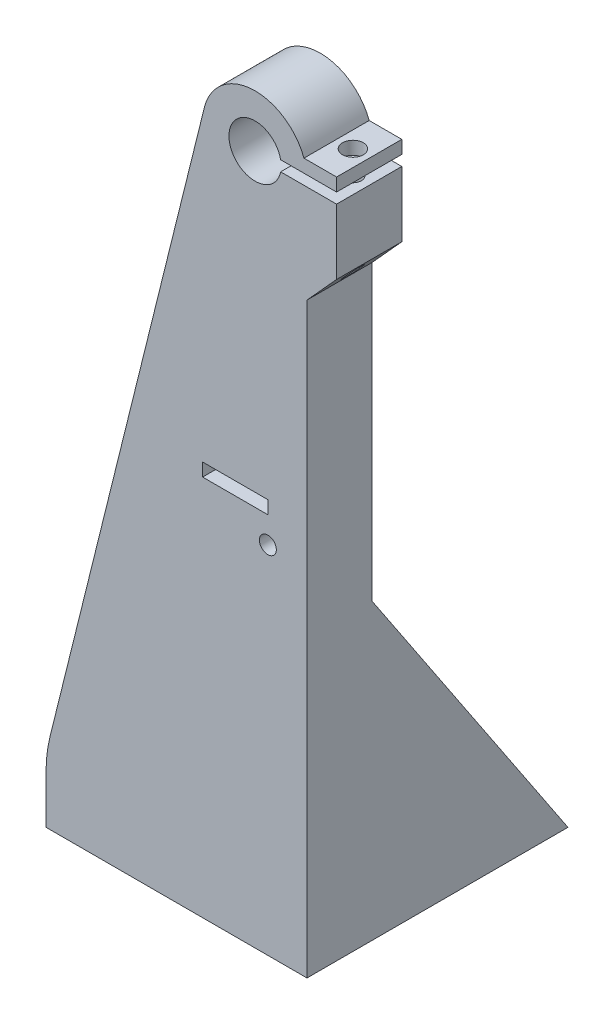
ISO-10303-21;
HEADER;
FILE_DESCRIPTION(('STEP AP214'),'2;1');
FILE_NAME('part.step','',(''),(''),'','','');
FILE_SCHEMA(('AUTOMOTIVE_DESIGN { 1 0 10303 214 1 1 1 1 }'));
ENDSEC;
DATA;
#1=APPLICATION_CONTEXT('core data for automotive mechanical design processes');
#2=APPLICATION_PROTOCOL_DEFINITION('international standard','automotive_design',2000,#1);
#3=PRODUCT_CONTEXT('',#1,'mechanical');
#4=PRODUCT('Part','Part','',(#3));
#5=PRODUCT_RELATED_PRODUCT_CATEGORY('part','',(#4));
#6=PRODUCT_DEFINITION_FORMATION('','',#4);
#7=PRODUCT_DEFINITION_CONTEXT('part definition',#1,'design');
#8=PRODUCT_DEFINITION('design','',#6,#7);
#9=PRODUCT_DEFINITION_SHAPE('','',#8);
#10=(LENGTH_UNIT() NAMED_UNIT(*) SI_UNIT(.MILLI.,.METRE.));
#11=(NAMED_UNIT(*) PLANE_ANGLE_UNIT() SI_UNIT($,.RADIAN.));
#12=(NAMED_UNIT(*) SI_UNIT($,.STERADIAN.) SOLID_ANGLE_UNIT());
#13=UNCERTAINTY_MEASURE_WITH_UNIT(LENGTH_MEASURE(1.E-05),#10,'distance_accuracy_value','');
#14=(GEOMETRIC_REPRESENTATION_CONTEXT(3) GLOBAL_UNCERTAINTY_ASSIGNED_CONTEXT((#13)) GLOBAL_UNIT_ASSIGNED_CONTEXT((#10,
#11,#12)) REPRESENTATION_CONTEXT('',''));
#15=CARTESIAN_POINT('',(0.,0.,0.));
#16=DIRECTION('',(0.,0.,1.));
#17=DIRECTION('',(1.,0.,0.));
#18=AXIS2_PLACEMENT_3D('',#15,#16,#17);
#19=CARTESIAN_POINT('',(32.0401005031471,0.,0.));
#20=DIRECTION('',(1.,0.,0.));
#21=DIRECTION('',(0.,0.,-1.));
#22=AXIS2_PLACEMENT_3D('',#19,#20,#21);
#23=PLANE('',#22);
#24=DIRECTION('',(0.,1.,0.));
#25=VECTOR('',#24,1.);
#26=CARTESIAN_POINT('',(32.0401005031471,0.,10.));
#27=LINE('',#26,#25);
#28=CARTESIAN_POINT('',(32.0401005031471,-105.8,10.));
#29=VERTEX_POINT('',#28);
#30=CARTESIAN_POINT('',(32.0401005031471,-98.3457751046788,10.));
#31=VERTEX_POINT('',#30);
#32=EDGE_CURVE('E37',#29,#31,#27,.T.);
#33=ORIENTED_EDGE('',*,*,#32,.T.);
#34=DIRECTION('',(0.,0.,-1.));
#35=VECTOR('',#34,1.);
#36=CARTESIAN_POINT('',(32.0401005031471,-98.3457751046788,10.));
#37=LINE('',#36,#35);
#38=CARTESIAN_POINT('',(32.0401005031471,-98.3457751046788,0.));
#39=VERTEX_POINT('',#38);
#40=EDGE_CURVE('E189',#31,#39,#37,.T.);
#41=ORIENTED_EDGE('',*,*,#40,.T.);
#42=DIRECTION('',(0.,1.,0.));
#43=VECTOR('',#42,1.);
#44=CARTESIAN_POINT('',(32.0401005031471,-98.3457751046788,0.));
#45=LINE('',#44,#43);
#46=CARTESIAN_POINT('',(32.0401005031471,-105.8,0.));
#47=VERTEX_POINT('',#46);
#48=EDGE_CURVE('E176',#47,#39,#45,.T.);
#49=ORIENTED_EDGE('',*,*,#48,.F.);
#50=DIRECTION('',(0.,0.,-1.));
#51=VECTOR('',#50,1.);
#52=CARTESIAN_POINT('',(32.0401005031471,-105.8,10.));
#53=LINE('',#52,#51);
#54=EDGE_CURVE('E185',#29,#47,#53,.T.);
#55=ORIENTED_EDGE('',*,*,#54,.F.);
#56=EDGE_LOOP('',(#33,#41,#49,#55));
#57=FACE_BOUND('',#56,.T.);
#58=ADVANCED_FACE('F33',(#57),#23,.F.);
#59=CARTESIAN_POINT('',(0.,0.,10.));
#60=DIRECTION('',(0.,0.,1.));
#61=DIRECTION('',(1.,0.,0.));
#62=AXIS2_PLACEMENT_3D('',#59,#60,#61);
#63=PLANE('',#62);
#64=ORIENTED_EDGE('',*,*,#32,.F.);
#65=DIRECTION('',(1.,0.,0.));
#66=VECTOR('',#65,1.);
#67=CARTESIAN_POINT('',(-7.95989949685295,-105.8,10.));
#68=LINE('',#67,#66);
#69=CARTESIAN_POINT('',(72.0401005031471,-105.8,10.));
#70=VERTEX_POINT('',#69);
#71=EDGE_CURVE('E186',#29,#70,#68,.T.);
#72=ORIENTED_EDGE('',*,*,#71,.T.);
#73=DIRECTION('',(0.,-1.,0.));
#74=VECTOR('',#73,1.);
#75=CARTESIAN_POINT('',(72.0401005031471,-15.8,10.));
#76=LINE('',#75,#74);
#77=CARTESIAN_POINT('',(72.0401005031471,-15.8,10.));
#78=VERTEX_POINT('',#77);
#79=EDGE_CURVE('E516',#78,#70,#76,.T.);
#80=ORIENTED_EDGE('',*,*,#79,.F.);
#81=DIRECTION('',(-0.671751074824167,-0.740776952579234,0.));
#82=VECTOR('',#81,1.);
#83=CARTESIAN_POINT('',(76.5741986043722,-10.8,10.));
#84=LINE('',#83,#82);
#85=CARTESIAN_POINT('',(76.5741986043722,-10.8,10.));
#86=VERTEX_POINT('',#85);
#87=EDGE_CURVE('E514',#86,#78,#84,.T.);
#88=ORIENTED_EDGE('',*,*,#87,.F.);
#89=DIRECTION('',(0.,-1.,0.));
#90=VECTOR('',#89,1.);
#91=CARTESIAN_POINT('',(76.5741986043722,-0.8,10.));
#92=LINE('',#91,#90);
#93=CARTESIAN_POINT('',(76.5741986043722,-0.8,10.));
#94=VERTEX_POINT('',#93);
#95=EDGE_CURVE('E480',#94,#86,#92,.T.);
#96=ORIENTED_EDGE('',*,*,#95,.F.);
#97=DIRECTION('',(1.,0.,0.));
#98=VECTOR('',#97,1.);
#99=CARTESIAN_POINT('',(72.0401005031471,-0.8,10.));
#100=LINE('',#99,#98);
#101=CARTESIAN_POINT('',(67.9993845947472,-0.8,10.));
#102=VERTEX_POINT('',#101);
#103=EDGE_CURVE('E511',#102,#94,#100,.T.);
#104=ORIENTED_EDGE('',*,*,#103,.F.);
#105=CARTESIAN_POINT('',(64.0802010062941,0.,10.));
#106=DIRECTION('',(0.,0.,1.));
#107=DIRECTION('',(1.,0.,0.));
#108=AXIS2_PLACEMENT_3D('',#105,#106,#107);
#109=CIRCLE('',#108,4.);
#110=CARTESIAN_POINT('',(67.9993845947472,0.800000000000001,10.));
#111=VERTEX_POINT('',#110);
#112=EDGE_CURVE('E470',#111,#102,#109,.T.);
#113=ORIENTED_EDGE('',*,*,#112,.F.);
#114=DIRECTION('',(-1.,0.,0.));
#115=VECTOR('',#114,1.);
#116=CARTESIAN_POINT('',(71.78331372245,0.8,10.));
#117=LINE('',#116,#115);
#118=CARTESIAN_POINT('',(76.5741986043722,0.800000000000001,10.));
#119=VERTEX_POINT('',#118);
#120=EDGE_CURVE('E468',#119,#111,#117,.T.);
#121=ORIENTED_EDGE('',*,*,#120,.F.);
#122=DIRECTION('',(0.,-1.,0.));
#123=VECTOR('',#122,1.);
#124=CARTESIAN_POINT('',(76.5741986043722,0.800000000000001,10.));
#125=LINE('',#124,#123);
#126=CARTESIAN_POINT('',(76.5741986043722,2.8,10.));
#127=VERTEX_POINT('',#126);
#128=EDGE_CURVE('E464',#127,#119,#125,.T.);
#129=ORIENTED_EDGE('',*,*,#128,.F.);
#130=DIRECTION('',(1.,0.,0.));
#131=VECTOR('',#130,1.);
#132=CARTESIAN_POINT('',(76.5741986043722,2.8,10.));
#133=LINE('',#132,#131);
#134=CARTESIAN_POINT('',(71.5741986043722,2.8,10.));
#135=VERTEX_POINT('',#134);
#136=EDGE_CURVE('E506',#135,#127,#133,.T.);
#137=ORIENTED_EDGE('',*,*,#136,.F.);
#138=CARTESIAN_POINT('',(64.0802010062941,0.,10.));
#139=DIRECTION('',(0.,0.,1.));
#140=DIRECTION('',(1.,0.,0.));
#141=AXIS2_PLACEMENT_3D('',#138,#139,#140);
#142=CIRCLE('',#141,8.);
#143=CARTESIAN_POINT('',(56.329416627519,1.98124746403259,10.));
#144=VERTEX_POINT('',#143);
#145=EDGE_CURVE('E455',#144,#135,#142,.F.);
#146=ORIENTED_EDGE('',*,*,#145,.F.);
#147=CARTESIAN_POINT('',(36.9524556805812,6.93436612411407,10.));
#148=DIRECTION('',(0.,0.,1.));
#149=DIRECTION('',(1.,0.,0.));
#150=AXIS2_PLACEMENT_3D('',#147,#148,#149);
#151=CIRCLE('',#150,20.);
#152=CARTESIAN_POINT('',(56.3146919132379,1.92399607083486,10.));
#153=VERTEX_POINT('',#152);
#154=EDGE_CURVE('E451',#153,#144,#151,.T.);
#155=ORIENTED_EDGE('',*,*,#154,.F.);
#156=DIRECTION('',(0.240828128500147,0.970567778428234,0.));
#157=VECTOR('',#156,1.);
#158=CARTESIAN_POINT('',(56.3146919132379,1.92399607083487,10.));
#159=LINE('',#158,#157);
#160=CARTESIAN_POINT('',(32.6778642704904,-93.3354050513996,10.));
#161=VERTEX_POINT('',#160);
#162=EDGE_CURVE('E445',#161,#153,#159,.T.);
#163=ORIENTED_EDGE('',*,*,#162,.F.);
#164=CARTESIAN_POINT('',(52.0401005031471,-98.3457751046788,10.));
#165=DIRECTION('',(0.,0.,1.));
#166=DIRECTION('',(1.,0.,0.));
#167=AXIS2_PLACEMENT_3D('',#164,#165,#166);
#168=CIRCLE('',#167,20.);
#169=EDGE_CURVE('E501',#31,#161,#168,.F.);
#170=ORIENTED_EDGE('',*,*,#169,.F.);
#171=EDGE_LOOP('',(#64,#72,#80,#88,#96,#104,#113,#121,#129,#137,#146,#155,#163,#170));
#172=FACE_BOUND('',#171,.T.);
#173=DIRECTION('',(-1.,0.,0.));
#174=VECTOR('',#173,1.);
#175=CARTESIAN_POINT('',(66.0401005031471,-47.3,10.));
#176=LINE('',#175,#174);
#177=CARTESIAN_POINT('',(66.0401005031471,-47.3,10.));
#178=VERTEX_POINT('',#177);
#179=CARTESIAN_POINT('',(56.0401005031471,-47.3,10.));
#180=VERTEX_POINT('',#179);
#181=EDGE_CURVE('E330',#178,#180,#176,.T.);
#182=ORIENTED_EDGE('',*,*,#181,.T.);
#183=DIRECTION('',(0.,1.,0.));
#184=VECTOR('',#183,1.);
#185=CARTESIAN_POINT('',(56.0401005031471,-45.3,10.));
#186=LINE('',#185,#184);
#187=CARTESIAN_POINT('',(56.0401005031471,-45.3,10.));
#188=VERTEX_POINT('',#187);
#189=EDGE_CURVE('E327',#180,#188,#186,.T.);
#190=ORIENTED_EDGE('',*,*,#189,.T.);
#191=DIRECTION('',(1.,0.,0.));
#192=VECTOR('',#191,1.);
#193=CARTESIAN_POINT('',(66.0401005031471,-45.3,10.));
#194=LINE('',#193,#192);
#195=CARTESIAN_POINT('',(66.0401005031471,-45.3,10.));
#196=VERTEX_POINT('',#195);
#197=EDGE_CURVE('E336',#188,#196,#194,.T.);
#198=ORIENTED_EDGE('',*,*,#197,.T.);
#199=DIRECTION('',(0.,-1.,0.));
#200=VECTOR('',#199,1.);
#201=CARTESIAN_POINT('',(66.0401005031471,-45.3,10.));
#202=LINE('',#201,#200);
#203=EDGE_CURVE('E333',#196,#178,#202,.T.);
#204=ORIENTED_EDGE('',*,*,#203,.T.);
#205=EDGE_LOOP('',(#182,#190,#198,#204));
#206=FACE_BOUND('',#205,.T.);
#207=CARTESIAN_POINT('',(66.0401005031471,-51.3,10.));
#208=DIRECTION('',(0.,0.,1.));
#209=DIRECTION('',(1.,0.,0.));
#210=AXIS2_PLACEMENT_3D('',#207,#208,#209);
#211=CIRCLE('',#210,1.3);
#212=CARTESIAN_POINT('',(67.3401005031471,-51.3,10.));
#213=VERTEX_POINT('',#212);
#214=EDGE_CURVE('E193',#213,#213,#211,.F.);
#215=ORIENTED_EDGE('',*,*,#214,.T.);
#216=EDGE_LOOP('',(#215));
#217=FACE_BOUND('',#216,.T.);
#218=ADVANCED_FACE('F341',(#172,#206,#217),#63,.T.);
#219=CARTESIAN_POINT('',(67.0401005031471,-96.8,-20.));
#220=DIRECTION('',(0.,-1.,0.));
#221=DIRECTION('',(0.,0.,-1.));
#222=AXIS2_PLACEMENT_3D('',#219,#220,#221);
#223=PLANE('',#222);
#224=CARTESIAN_POINT('',(67.0401005031471,-96.8,-20.));
#225=DIRECTION('',(0.,1.,0.));
#226=DIRECTION('',(0.,0.,-1.));
#227=AXIS2_PLACEMENT_3D('',#224,#225,#226);
#228=CIRCLE('',#227,1.8);
#229=CARTESIAN_POINT('',(67.0401005031471,-96.8,-21.8));
#230=VERTEX_POINT('',#229);
#231=EDGE_CURVE('E278',#230,#230,#228,.T.);
#232=ORIENTED_EDGE('',*,*,#231,.F.);
#233=EDGE_LOOP('',(#232));
#234=FACE_BOUND('',#233,.T.);
#235=ADVANCED_FACE('F364',(#234),#223,.T.);
#236=CARTESIAN_POINT('',(60.0401005031471,-96.8,5.));
#237=DIRECTION('',(0.,-1.,0.));
#238=DIRECTION('',(0.,0.,-1.));
#239=AXIS2_PLACEMENT_3D('',#236,#237,#238);
#240=PLANE('',#239);
#241=CARTESIAN_POINT('',(60.0401005031471,-96.8,5.));
#242=DIRECTION('',(0.,1.,0.));
#243=DIRECTION('',(0.,0.,-1.));
#244=AXIS2_PLACEMENT_3D('',#241,#242,#243);
#245=CIRCLE('',#244,1.8);
#246=CARTESIAN_POINT('',(60.0401005031471,-96.8,3.2));
#247=VERTEX_POINT('',#246);
#248=EDGE_CURVE('E43',#247,#247,#245,.T.);
#249=ORIENTED_EDGE('',*,*,#248,.F.);
#250=EDGE_LOOP('',(#249));
#251=FACE_BOUND('',#250,.T.);
#252=ADVANCED_FACE('F552',(#251),#240,.T.);
#253=CARTESIAN_POINT('',(42.0401005031471,-96.8,5.));
#254=DIRECTION('',(0.,-1.,0.));
#255=DIRECTION('',(0.,0.,-1.));
#256=AXIS2_PLACEMENT_3D('',#253,#254,#255);
#257=PLANE('',#256);
#258=CARTESIAN_POINT('',(42.0401005031471,-96.8,5.));
#259=DIRECTION('',(0.,1.,0.));
#260=DIRECTION('',(0.,0.,-1.));
#261=AXIS2_PLACEMENT_3D('',#258,#259,#260);
#262=CIRCLE('',#261,1.8);
#263=CARTESIAN_POINT('',(42.0401005031471,-96.8,3.2));
#264=VERTEX_POINT('',#263);
#265=EDGE_CURVE('E282',#264,#264,#262,.T.);
#266=ORIENTED_EDGE('',*,*,#265,.F.);
#267=EDGE_LOOP('',(#266));
#268=FACE_BOUND('',#267,.T.);
#269=ADVANCED_FACE('F533',(#268),#257,.T.);
#270=CARTESIAN_POINT('',(67.0401005031471,-96.8,-2.));
#271=DIRECTION('',(0.,-1.,0.));
#272=DIRECTION('',(0.,0.,-1.));
#273=AXIS2_PLACEMENT_3D('',#270,#271,#272);
#274=PLANE('',#273);
#275=CARTESIAN_POINT('',(67.0401005031471,-96.8,-2.));
#276=DIRECTION('',(0.,1.,0.));
#277=DIRECTION('',(0.,0.,-1.));
#278=AXIS2_PLACEMENT_3D('',#275,#276,#277);
#279=CIRCLE('',#278,1.8);
#280=CARTESIAN_POINT('',(67.0401005031471,-96.8,-3.8));
#281=VERTEX_POINT('',#280);
#282=EDGE_CURVE('E288',#281,#281,#279,.T.);
#283=ORIENTED_EDGE('',*,*,#282,.F.);
#284=EDGE_LOOP('',(#283));
#285=FACE_BOUND('',#284,.T.);
#286=ADVANCED_FACE('F525',(#285),#274,.T.);
#287=CARTESIAN_POINT('',(62.0401005031471,0.,0.));
#288=DIRECTION('',(-1.,0.,0.));
#289=DIRECTION('',(0.,1.,0.));
#290=AXIS2_PLACEMENT_3D('',#287,#288,#289);
#291=PLANE('',#290);
#292=DIRECTION('',(0.,0.,1.));
#293=VECTOR('',#292,1.);
#294=CARTESIAN_POINT('',(62.040100503147,-105.8,-30.));
#295=LINE('',#294,#293);
#296=CARTESIAN_POINT('',(62.040100503147,-105.8,-30.));
#297=VERTEX_POINT('',#296);
#298=CARTESIAN_POINT('',(62.040100503147,-105.8,-2.));
#299=VERTEX_POINT('',#298);
#300=EDGE_CURVE('E263',#297,#299,#295,.T.);
#301=ORIENTED_EDGE('',*,*,#300,.T.);
#302=DIRECTION('',(0.,1.,0.));
#303=VECTOR('',#302,1.);
#304=CARTESIAN_POINT('',(62.0401005031471,0.,-2.));
#305=LINE('',#304,#303);
#306=CARTESIAN_POINT('',(62.0401005031471,-63.8,-2.));
#307=VERTEX_POINT('',#306);
#308=EDGE_CURVE('E205',#299,#307,#305,.T.);
#309=ORIENTED_EDGE('',*,*,#308,.T.);
#310=DIRECTION('',(0.,-0.832050294337843,-0.554700196225229));
#311=VECTOR('',#310,1.);
#312=CARTESIAN_POINT('',(62.0401005031471,-60.8,0.));
#313=LINE('',#312,#311);
#314=EDGE_CURVE('E257',#307,#297,#313,.T.);
#315=ORIENTED_EDGE('',*,*,#314,.T.);
#316=EDGE_LOOP('',(#301,#309,#315));
#317=FACE_BOUND('',#316,.T.);
#318=ADVANCED_FACE('F523',(#317),#291,.T.);
#319=CARTESIAN_POINT('',(60.0401005031471,0.,-2.));
#320=DIRECTION('',(0.,1.,0.));
#321=DIRECTION('',(-1.,0.,0.));
#322=AXIS2_PLACEMENT_3D('',#319,#320,#321);
#323=CYLINDRICAL_SURFACE('',#322,2.);
#324=CARTESIAN_POINT('',(60.040100503147,-105.8,-2.));
#325=DIRECTION('',(0.,1.,0.));
#326=DIRECTION('',(-1.,0.,0.));
#327=AXIS2_PLACEMENT_3D('',#324,#325,#326);
#328=CIRCLE('',#327,2.);
#329=CARTESIAN_POINT('',(60.040100503147,-105.8,0.));
#330=VERTEX_POINT('',#329);
#331=EDGE_CURVE('E495',#330,#299,#328,.T.);
#332=ORIENTED_EDGE('',*,*,#331,.F.);
#333=DIRECTION('',(0.,1.,0.));
#334=VECTOR('',#333,1.);
#335=CARTESIAN_POINT('',(60.040100503147,-98.3457751046788,0.));
#336=LINE('',#335,#334);
#337=CARTESIAN_POINT('',(60.0401005031471,-60.8,0.));
#338=VERTEX_POINT('',#337);
#339=EDGE_CURVE('E494',#338,#330,#336,.F.);
#340=ORIENTED_EDGE('',*,*,#339,.F.);
#341=CARTESIAN_POINT('',(60.0401005031471,-63.8,-2.));
#342=DIRECTION('',(0.,-0.554700196225229,0.832050294337843));
#343=DIRECTION('',(0.,0.832050294337844,0.554700196225229));
#344=AXIS2_PLACEMENT_3D('',#341,#342,#343);
#345=ELLIPSE('',#344,3.60555127546399,2.);
#346=EDGE_CURVE('E489',#307,#338,#345,.T.);
#347=ORIENTED_EDGE('',*,*,#346,.F.);
#348=ORIENTED_EDGE('',*,*,#308,.F.);
#349=EDGE_LOOP('',(#332,#340,#347,#348));
#350=FACE_BOUND('',#349,.T.);
#351=ADVANCED_FACE('F498',(#350),#323,.F.);
#352=CARTESIAN_POINT('',(67.0401005031471,-96.8,-20.));
#353=DIRECTION('',(0.,-1.,0.));
#354=DIRECTION('',(0.,0.,-1.));
#355=AXIS2_PLACEMENT_3D('',#352,#353,#354);
#356=CYLINDRICAL_SURFACE('',#355,1.8);
#357=ORIENTED_EDGE('',*,*,#231,.T.);
#358=EDGE_LOOP('',(#357));
#359=FACE_BOUND('',#358,.T.);
#360=CARTESIAN_POINT('',(67.0401005031471,-105.8,-20.));
#361=DIRECTION('',(0.,1.,0.));
#362=DIRECTION('',(0.,0.,-1.));
#363=AXIS2_PLACEMENT_3D('',#360,#361,#362);
#364=CIRCLE('',#363,1.8);
#365=CARTESIAN_POINT('',(67.0401005031471,-105.8,-21.8));
#366=VERTEX_POINT('',#365);
#367=EDGE_CURVE('E290',#366,#366,#364,.T.);
#368=ORIENTED_EDGE('',*,*,#367,.F.);
#369=EDGE_LOOP('',(#368));
#370=FACE_BOUND('',#369,.T.);
#371=ADVANCED_FACE('F531',(#359,#370),#356,.F.);
#372=CARTESIAN_POINT('',(60.0401005031471,-96.8,5.));
#373=DIRECTION('',(0.,-1.,0.));
#374=DIRECTION('',(0.,0.,-1.));
#375=AXIS2_PLACEMENT_3D('',#372,#373,#374);
#376=CYLINDRICAL_SURFACE('',#375,1.8);
#377=ORIENTED_EDGE('',*,*,#248,.T.);
#378=EDGE_LOOP('',(#377));
#379=FACE_BOUND('',#378,.T.);
#380=CARTESIAN_POINT('',(60.0401005031471,-105.8,5.));
#381=DIRECTION('',(0.,1.,0.));
#382=DIRECTION('',(0.,0.,-1.));
#383=AXIS2_PLACEMENT_3D('',#380,#381,#382);
#384=CIRCLE('',#383,1.8);
#385=CARTESIAN_POINT('',(60.0401005031471,-105.8,3.2));
#386=VERTEX_POINT('',#385);
#387=EDGE_CURVE('E11',#386,#386,#384,.T.);
#388=ORIENTED_EDGE('',*,*,#387,.F.);
#389=EDGE_LOOP('',(#388));
#390=FACE_BOUND('',#389,.T.);
#391=ADVANCED_FACE('F548',(#379,#390),#376,.F.);
#392=CARTESIAN_POINT('',(42.0401005031471,-96.8,5.));
#393=DIRECTION('',(0.,-1.,0.));
#394=DIRECTION('',(0.,0.,-1.));
#395=AXIS2_PLACEMENT_3D('',#392,#393,#394);
#396=CYLINDRICAL_SURFACE('',#395,1.8);
#397=ORIENTED_EDGE('',*,*,#265,.T.);
#398=EDGE_LOOP('',(#397));
#399=FACE_BOUND('',#398,.T.);
#400=CARTESIAN_POINT('',(42.0401005031471,-105.8,5.));
#401=DIRECTION('',(0.,1.,0.));
#402=DIRECTION('',(0.,0.,-1.));
#403=AXIS2_PLACEMENT_3D('',#400,#401,#402);
#404=CIRCLE('',#403,1.8);
#405=CARTESIAN_POINT('',(42.0401005031471,-105.8,3.2));
#406=VERTEX_POINT('',#405);
#407=EDGE_CURVE('E279',#406,#406,#404,.T.);
#408=ORIENTED_EDGE('',*,*,#407,.F.);
#409=EDGE_LOOP('',(#408));
#410=FACE_BOUND('',#409,.T.);
#411=ADVANCED_FACE('F544',(#399,#410),#396,.F.);
#412=CARTESIAN_POINT('',(67.0401005031471,-96.8,-2.));
#413=DIRECTION('',(0.,-1.,0.));
#414=DIRECTION('',(0.,0.,-1.));
#415=AXIS2_PLACEMENT_3D('',#412,#413,#414);
#416=CYLINDRICAL_SURFACE('',#415,1.8);
#417=ORIENTED_EDGE('',*,*,#282,.T.);
#418=EDGE_LOOP('',(#417));
#419=FACE_BOUND('',#418,.T.);
#420=CARTESIAN_POINT('',(67.0401005031471,-105.8,-2.));
#421=DIRECTION('',(0.,1.,0.));
#422=DIRECTION('',(0.,0.,-1.));
#423=AXIS2_PLACEMENT_3D('',#420,#421,#422);
#424=CIRCLE('',#423,1.8);
#425=CARTESIAN_POINT('',(67.0401005031471,-105.8,-3.8));
#426=VERTEX_POINT('',#425);
#427=EDGE_CURVE('E285',#426,#426,#424,.T.);
#428=ORIENTED_EDGE('',*,*,#427,.F.);
#429=EDGE_LOOP('',(#428));
#430=FACE_BOUND('',#429,.T.);
#431=ADVANCED_FACE('F547',(#419,#430),#416,.F.);
#432=CARTESIAN_POINT('',(62.0401005031471,-60.8,0.));
#433=DIRECTION('',(0.,-0.554700196225229,0.832050294337843));
#434=DIRECTION('',(0.,-0.832050294337844,-0.554700196225229));
#435=AXIS2_PLACEMENT_3D('',#432,#433,#434);
#436=PLANE('',#435);
#437=DIRECTION('',(0.,-0.832050294337843,-0.554700196225229));
#438=VECTOR('',#437,1.);
#439=CARTESIAN_POINT('',(72.0401005031471,-60.8,0.));
#440=LINE('',#439,#438);
#441=CARTESIAN_POINT('',(72.0401005031471,-60.8,0.));
#442=VERTEX_POINT('',#441);
#443=CARTESIAN_POINT('',(72.040100503147,-105.8,-30.));
#444=VERTEX_POINT('',#443);
#445=EDGE_CURVE('E260',#442,#444,#440,.T.);
#446=ORIENTED_EDGE('',*,*,#445,.T.);
#447=DIRECTION('',(1.,0.,0.));
#448=VECTOR('',#447,1.);
#449=CARTESIAN_POINT('',(62.040100503147,-105.8,-30.));
#450=LINE('',#449,#448);
#451=EDGE_CURVE('E254',#297,#444,#450,.T.);
#452=ORIENTED_EDGE('',*,*,#451,.F.);
#453=ORIENTED_EDGE('',*,*,#314,.F.);
#454=ORIENTED_EDGE('',*,*,#346,.T.);
#455=DIRECTION('',(1.,0.,0.));
#456=VECTOR('',#455,1.);
#457=CARTESIAN_POINT('',(62.0401005031471,-60.8,0.));
#458=LINE('',#457,#456);
#459=EDGE_CURVE('E253',#338,#442,#458,.T.);
#460=ORIENTED_EDGE('',*,*,#459,.T.);
#461=EDGE_LOOP('',(#446,#452,#453,#454,#460));
#462=FACE_BOUND('',#461,.T.);
#463=ADVANCED_FACE('F373',(#462),#436,.F.);
#464=CARTESIAN_POINT('',(-7.95989949685295,-105.8,10.));
#465=DIRECTION('',(0.,1.,0.));
#466=DIRECTION('',(-1.,0.,0.));
#467=AXIS2_PLACEMENT_3D('',#464,#465,#466);
#468=PLANE('',#467);
#469=ORIENTED_EDGE('',*,*,#427,.T.);
#470=EDGE_LOOP('',(#469));
#471=FACE_BOUND('',#470,.T.);
#472=ORIENTED_EDGE('',*,*,#407,.T.);
#473=EDGE_LOOP('',(#472));
#474=FACE_BOUND('',#473,.T.);
#475=ORIENTED_EDGE('',*,*,#387,.T.);
#476=EDGE_LOOP('',(#475));
#477=FACE_BOUND('',#476,.T.);
#478=ORIENTED_EDGE('',*,*,#367,.T.);
#479=EDGE_LOOP('',(#478));
#480=FACE_BOUND('',#479,.T.);
#481=ORIENTED_EDGE('',*,*,#71,.F.);
#482=ORIENTED_EDGE('',*,*,#54,.T.);
#483=DIRECTION('',(1.,0.,0.));
#484=VECTOR('',#483,1.);
#485=CARTESIAN_POINT('',(-7.95989949685295,-105.8,0.));
#486=LINE('',#485,#484);
#487=EDGE_CURVE('E183',#47,#330,#486,.T.);
#488=ORIENTED_EDGE('',*,*,#487,.T.);
#489=ORIENTED_EDGE('',*,*,#331,.T.);
#490=ORIENTED_EDGE('',*,*,#300,.F.);
#491=ORIENTED_EDGE('',*,*,#451,.T.);
#492=DIRECTION('',(0.,0.,-1.));
#493=VECTOR('',#492,1.);
#494=CARTESIAN_POINT('',(72.0401005031471,-105.8,10.));
#495=LINE('',#494,#493);
#496=EDGE_CURVE('E50',#70,#444,#495,.T.);
#497=ORIENTED_EDGE('',*,*,#496,.F.);
#498=EDGE_LOOP('',(#481,#482,#488,#489,#490,#491,#497));
#499=FACE_BOUND('',#498,.T.);
#500=ADVANCED_FACE('F369',(#471,#474,#477,#480,#499),#468,.F.);
#501=CARTESIAN_POINT('',(72.0401005031471,-15.8,10.));
#502=DIRECTION('',(1.,0.,0.));
#503=DIRECTION('',(0.,1.,0.));
#504=AXIS2_PLACEMENT_3D('',#501,#502,#503);
#505=PLANE('',#504);
#506=DIRECTION('',(0.,0.,-1.));
#507=VECTOR('',#506,1.);
#508=CARTESIAN_POINT('',(72.0401005031471,-15.8,10.));
#509=LINE('',#508,#507);
#510=CARTESIAN_POINT('',(72.0401005031471,-15.8,0.));
#511=VERTEX_POINT('',#510);
#512=EDGE_CURVE('E321',#78,#511,#509,.T.);
#513=ORIENTED_EDGE('',*,*,#512,.F.);
#514=ORIENTED_EDGE('',*,*,#79,.T.);
#515=ORIENTED_EDGE('',*,*,#496,.T.);
#516=ORIENTED_EDGE('',*,*,#445,.F.);
#517=DIRECTION('',(0.,-1.,0.));
#518=VECTOR('',#517,1.);
#519=CARTESIAN_POINT('',(72.0401005031471,-15.8,0.));
#520=LINE('',#519,#518);
#521=EDGE_CURVE('E234',#511,#442,#520,.T.);
#522=ORIENTED_EDGE('',*,*,#521,.F.);
#523=EDGE_LOOP('',(#513,#514,#515,#516,#522));
#524=FACE_BOUND('',#523,.T.);
#525=ADVANCED_FACE('F372',(#524),#505,.T.);
#526=CARTESIAN_POINT('',(76.5741986043722,-10.8,10.));
#527=DIRECTION('',(0.740776952579234,-0.671751074824167,0.));
#528=DIRECTION('',(0.671751074824167,0.740776952579234,0.));
#529=AXIS2_PLACEMENT_3D('',#526,#527,#528);
#530=PLANE('',#529);
#531=CARTESIAN_POINT('',(74.0741986043722,-13.5568878575041,5.));
#532=DIRECTION('',(0.740776952579234,-0.671751074824167,0.));
#533=DIRECTION('',(0.671751074824167,0.740776952579234,0.));
#534=AXIS2_PLACEMENT_3D('',#531,#532,#533);
#535=ELLIPSE('',#534,1.9352406698274,1.3);
#536=CARTESIAN_POINT('',(75.3741986043722,-12.123306171602,5.));
#537=VERTEX_POINT('',#536);
#538=EDGE_CURVE('E272',#537,#537,#535,.T.);
#539=ORIENTED_EDGE('',*,*,#538,.F.);
#540=EDGE_LOOP('',(#539));
#541=FACE_BOUND('',#540,.T.);
#542=DIRECTION('',(0.,0.,-1.));
#543=VECTOR('',#542,1.);
#544=CARTESIAN_POINT('',(76.5741986043722,-10.8,10.));
#545=LINE('',#544,#543);
#546=CARTESIAN_POINT('',(76.5741986043722,-10.8,0.));
#547=VERTEX_POINT('',#546);
#548=EDGE_CURVE('E319',#86,#547,#545,.T.);
#549=ORIENTED_EDGE('',*,*,#548,.F.);
#550=ORIENTED_EDGE('',*,*,#87,.T.);
#551=ORIENTED_EDGE('',*,*,#512,.T.);
#552=DIRECTION('',(-0.671751074824167,-0.740776952579234,0.));
#553=VECTOR('',#552,1.);
#554=CARTESIAN_POINT('',(76.5741986043722,-10.8,0.));
#555=LINE('',#554,#553);
#556=EDGE_CURVE('E231',#547,#511,#555,.T.);
#557=ORIENTED_EDGE('',*,*,#556,.F.);
#558=EDGE_LOOP('',(#549,#550,#551,#557));
#559=FACE_BOUND('',#558,.T.);
#560=ADVANCED_FACE('F377',(#541,#559),#530,.T.);
#561=CARTESIAN_POINT('',(76.5741986043722,-0.8,10.));
#562=DIRECTION('',(1.,0.,0.));
#563=DIRECTION('',(0.,1.,0.));
#564=AXIS2_PLACEMENT_3D('',#561,#562,#563);
#565=PLANE('',#564);
#566=DIRECTION('',(0.,0.,-1.));
#567=VECTOR('',#566,1.);
#568=CARTESIAN_POINT('',(76.5741986043722,-0.8,10.));
#569=LINE('',#568,#567);
#570=CARTESIAN_POINT('',(76.5741986043722,-0.8,0.));
#571=VERTEX_POINT('',#570);
#572=EDGE_CURVE('E317',#94,#571,#569,.T.);
#573=ORIENTED_EDGE('',*,*,#572,.F.);
#574=ORIENTED_EDGE('',*,*,#95,.T.);
#575=ORIENTED_EDGE('',*,*,#548,.T.);
#576=DIRECTION('',(0.,-1.,0.));
#577=VECTOR('',#576,1.);
#578=CARTESIAN_POINT('',(76.5741986043722,-0.8,0.));
#579=LINE('',#578,#577);
#580=EDGE_CURVE('E228',#571,#547,#579,.T.);
#581=ORIENTED_EDGE('',*,*,#580,.F.);
#582=EDGE_LOOP('',(#573,#574,#575,#581));
#583=FACE_BOUND('',#582,.T.);
#584=ADVANCED_FACE('F380',(#583),#565,.T.);
#585=CARTESIAN_POINT('',(74.0741986043722,-105.801,5.));
#586=DIRECTION('',(0.,1.,0.));
#587=DIRECTION('',(0.,0.,1.));
#588=AXIS2_PLACEMENT_3D('',#585,#586,#587);
#589=CYLINDRICAL_SURFACE('',#588,1.3);
#590=ORIENTED_EDGE('',*,*,#538,.T.);
#591=EDGE_LOOP('',(#590));
#592=FACE_BOUND('',#591,.T.);
#593=CARTESIAN_POINT('',(74.0741986043722,-0.8,5.));
#594=DIRECTION('',(0.,-1.,0.));
#595=DIRECTION('',(0.,0.,1.));
#596=AXIS2_PLACEMENT_3D('',#593,#594,#595);
#597=CIRCLE('',#596,1.3);
#598=CARTESIAN_POINT('',(74.0741986043722,-0.8,6.3));
#599=VERTEX_POINT('',#598);
#600=EDGE_CURVE('E275',#599,#599,#597,.T.);
#601=ORIENTED_EDGE('',*,*,#600,.F.);
#602=EDGE_LOOP('',(#601));
#603=FACE_BOUND('',#602,.T.);
#604=ADVANCED_FACE('F384',(#592,#603),#589,.F.);
#605=CARTESIAN_POINT('',(72.0401005031471,-0.8,10.));
#606=DIRECTION('',(0.,1.,0.));
#607=DIRECTION('',(0.,0.,1.));
#608=AXIS2_PLACEMENT_3D('',#605,#606,#607);
#609=PLANE('',#608);
#610=ORIENTED_EDGE('',*,*,#600,.T.);
#611=EDGE_LOOP('',(#610));
#612=FACE_BOUND('',#611,.T.);
#613=DIRECTION('',(0.,0.,-1.));
#614=VECTOR('',#613,1.);
#615=CARTESIAN_POINT('',(67.9993845947472,-0.8,10.));
#616=LINE('',#615,#614);
#617=CARTESIAN_POINT('',(67.9993845947472,-0.8,0.));
#618=VERTEX_POINT('',#617);
#619=EDGE_CURVE('E315',#102,#618,#616,.T.);
#620=ORIENTED_EDGE('',*,*,#619,.F.);
#621=ORIENTED_EDGE('',*,*,#103,.T.);
#622=ORIENTED_EDGE('',*,*,#572,.T.);
#623=DIRECTION('',(1.,0.,0.));
#624=VECTOR('',#623,1.);
#625=CARTESIAN_POINT('',(72.0401005031471,-0.8,0.));
#626=LINE('',#625,#624);
#627=EDGE_CURVE('E225',#618,#571,#626,.T.);
#628=ORIENTED_EDGE('',*,*,#627,.F.);
#629=EDGE_LOOP('',(#620,#621,#622,#628));
#630=FACE_BOUND('',#629,.T.);
#631=ADVANCED_FACE('F386',(#612,#630),#609,.T.);
#632=CARTESIAN_POINT('',(64.0802010062941,0.,10.));
#633=DIRECTION('',(0.,0.,-1.));
#634=DIRECTION('',(-1.,0.,0.));
#635=AXIS2_PLACEMENT_3D('',#632,#633,#634);
#636=CYLINDRICAL_SURFACE('',#635,4.);
#637=DIRECTION('',(0.,0.,-1.));
#638=VECTOR('',#637,1.);
#639=CARTESIAN_POINT('',(67.9993845947472,0.800000000000001,10.));
#640=LINE('',#639,#638);
#641=CARTESIAN_POINT('',(67.9993845947472,0.800000000000001,0.));
#642=VERTEX_POINT('',#641);
#643=EDGE_CURVE('E313',#111,#642,#640,.T.);
#644=ORIENTED_EDGE('',*,*,#643,.F.);
#645=ORIENTED_EDGE('',*,*,#112,.T.);
#646=ORIENTED_EDGE('',*,*,#619,.T.);
#647=CARTESIAN_POINT('',(64.0802010062941,0.,0.));
#648=DIRECTION('',(0.,0.,1.));
#649=DIRECTION('',(-1.,0.,0.));
#650=AXIS2_PLACEMENT_3D('',#647,#648,#649);
#651=CIRCLE('',#650,4.);
#652=EDGE_CURVE('E222',#642,#618,#651,.T.);
#653=ORIENTED_EDGE('',*,*,#652,.F.);
#654=EDGE_LOOP('',(#644,#645,#646,#653));
#655=FACE_BOUND('',#654,.T.);
#656=ADVANCED_FACE('F389',(#655),#636,.F.);
#657=CARTESIAN_POINT('',(71.78331372245,0.8,10.));
#658=DIRECTION('',(0.,-1.,0.));
#659=DIRECTION('',(1.,0.,0.));
#660=AXIS2_PLACEMENT_3D('',#657,#658,#659);
#661=PLANE('',#660);
#662=CARTESIAN_POINT('',(74.0741986043722,0.799999999999995,5.));
#663=DIRECTION('',(0.,-1.,0.));
#664=DIRECTION('',(1.,0.,0.));
#665=AXIS2_PLACEMENT_3D('',#662,#663,#664);
#666=CIRCLE('',#665,1.6);
#667=CARTESIAN_POINT('',(75.6741986043722,0.799999999999995,5.));
#668=VERTEX_POINT('',#667);
#669=EDGE_CURVE('E269',#668,#668,#666,.T.);
#670=ORIENTED_EDGE('',*,*,#669,.F.);
#671=EDGE_LOOP('',(#670));
#672=FACE_BOUND('',#671,.T.);
#673=DIRECTION('',(0.,0.,-1.));
#674=VECTOR('',#673,1.);
#675=CARTESIAN_POINT('',(76.5741986043722,0.800000000000001,10.));
#676=LINE('',#675,#674);
#677=CARTESIAN_POINT('',(76.5741986043722,0.800000000000001,0.));
#678=VERTEX_POINT('',#677);
#679=EDGE_CURVE('E311',#119,#678,#676,.T.);
#680=ORIENTED_EDGE('',*,*,#679,.F.);
#681=ORIENTED_EDGE('',*,*,#120,.T.);
#682=ORIENTED_EDGE('',*,*,#643,.T.);
#683=DIRECTION('',(-1.,0.,0.));
#684=VECTOR('',#683,1.);
#685=CARTESIAN_POINT('',(71.78331372245,0.8,0.));
#686=LINE('',#685,#684);
#687=EDGE_CURVE('E219',#678,#642,#686,.T.);
#688=ORIENTED_EDGE('',*,*,#687,.F.);
#689=EDGE_LOOP('',(#680,#681,#682,#688));
#690=FACE_BOUND('',#689,.T.);
#691=ADVANCED_FACE('F393',(#672,#690),#661,.T.);
#692=CARTESIAN_POINT('',(76.5741986043722,0.800000000000001,10.));
#693=DIRECTION('',(1.,0.,0.));
#694=DIRECTION('',(0.,0.,-1.));
#695=AXIS2_PLACEMENT_3D('',#692,#693,#694);
#696=PLANE('',#695);
#697=DIRECTION('',(0.,0.,-1.));
#698=VECTOR('',#697,1.);
#699=CARTESIAN_POINT('',(76.5741986043722,2.8,10.));
#700=LINE('',#699,#698);
#701=CARTESIAN_POINT('',(76.5741986043722,2.8,0.));
#702=VERTEX_POINT('',#701);
#703=EDGE_CURVE('E309',#127,#702,#700,.T.);
#704=ORIENTED_EDGE('',*,*,#703,.F.);
#705=ORIENTED_EDGE('',*,*,#128,.T.);
#706=ORIENTED_EDGE('',*,*,#679,.T.);
#707=DIRECTION('',(0.,-1.,0.));
#708=VECTOR('',#707,1.);
#709=CARTESIAN_POINT('',(76.5741986043722,0.800000000000001,0.));
#710=LINE('',#709,#708);
#711=EDGE_CURVE('E216',#702,#678,#710,.T.);
#712=ORIENTED_EDGE('',*,*,#711,.F.);
#713=EDGE_LOOP('',(#704,#705,#706,#712));
#714=FACE_BOUND('',#713,.T.);
#715=ADVANCED_FACE('F397',(#714),#696,.T.);
#716=CARTESIAN_POINT('',(74.0741986043722,-105.801,5.));
#717=DIRECTION('',(0.,1.,0.));
#718=DIRECTION('',(0.,0.,1.));
#719=AXIS2_PLACEMENT_3D('',#716,#717,#718);
#720=CYLINDRICAL_SURFACE('',#719,1.6);
#721=ORIENTED_EDGE('',*,*,#669,.T.);
#722=EDGE_LOOP('',(#721));
#723=FACE_BOUND('',#722,.T.);
#724=CARTESIAN_POINT('',(74.0741986043722,2.8,5.));
#725=DIRECTION('',(0.,-1.,0.));
#726=DIRECTION('',(0.,0.,1.));
#727=AXIS2_PLACEMENT_3D('',#724,#725,#726);
#728=CIRCLE('',#727,1.6);
#729=CARTESIAN_POINT('',(74.0741986043722,2.8,6.6));
#730=VERTEX_POINT('',#729);
#731=EDGE_CURVE('E262',#730,#730,#728,.T.);
#732=ORIENTED_EDGE('',*,*,#731,.F.);
#733=EDGE_LOOP('',(#732));
#734=FACE_BOUND('',#733,.T.);
#735=ADVANCED_FACE('F401',(#723,#734),#720,.F.);
#736=CARTESIAN_POINT('',(76.5741986043722,2.8,10.));
#737=DIRECTION('',(0.,1.,0.));
#738=DIRECTION('',(0.,0.,1.));
#739=AXIS2_PLACEMENT_3D('',#736,#737,#738);
#740=PLANE('',#739);
#741=ORIENTED_EDGE('',*,*,#731,.T.);
#742=EDGE_LOOP('',(#741));
#743=FACE_BOUND('',#742,.T.);
#744=DIRECTION('',(0.,0.,-1.));
#745=VECTOR('',#744,1.);
#746=CARTESIAN_POINT('',(71.5741986043722,2.8,10.));
#747=LINE('',#746,#745);
#748=CARTESIAN_POINT('',(71.5741986043722,2.8,0.));
#749=VERTEX_POINT('',#748);
#750=EDGE_CURVE('E307',#135,#749,#747,.T.);
#751=ORIENTED_EDGE('',*,*,#750,.F.);
#752=ORIENTED_EDGE('',*,*,#136,.T.);
#753=ORIENTED_EDGE('',*,*,#703,.T.);
#754=DIRECTION('',(1.,0.,0.));
#755=VECTOR('',#754,1.);
#756=CARTESIAN_POINT('',(76.5741986043722,2.8,0.));
#757=LINE('',#756,#755);
#758=EDGE_CURVE('E213',#749,#702,#757,.T.);
#759=ORIENTED_EDGE('',*,*,#758,.F.);
#760=EDGE_LOOP('',(#751,#752,#753,#759));
#761=FACE_BOUND('',#760,.T.);
#762=ADVANCED_FACE('F403',(#743,#761),#740,.T.);
#763=CARTESIAN_POINT('',(64.0802010062941,0.,10.));
#764=DIRECTION('',(0.,0.,-1.));
#765=DIRECTION('',(-1.,0.,0.));
#766=AXIS2_PLACEMENT_3D('',#763,#764,#765);
#767=CYLINDRICAL_SURFACE('',#766,8.);
#768=DIRECTION('',(0.,0.,-1.));
#769=VECTOR('',#768,1.);
#770=CARTESIAN_POINT('',(56.329416627519,1.98124746403259,10.));
#771=LINE('',#770,#769);
#772=CARTESIAN_POINT('',(56.329416627519,1.98124746403259,0.));
#773=VERTEX_POINT('',#772);
#774=EDGE_CURVE('E305',#144,#773,#771,.T.);
#775=ORIENTED_EDGE('',*,*,#774,.F.);
#776=ORIENTED_EDGE('',*,*,#145,.T.);
#777=ORIENTED_EDGE('',*,*,#750,.T.);
#778=CARTESIAN_POINT('',(64.0802010062941,0.,0.));
#779=DIRECTION('',(0.,0.,-1.));
#780=DIRECTION('',(-1.,0.,0.));
#781=AXIS2_PLACEMENT_3D('',#778,#779,#780);
#782=CIRCLE('',#781,8.);
#783=EDGE_CURVE('E210',#773,#749,#782,.T.);
#784=ORIENTED_EDGE('',*,*,#783,.F.);
#785=EDGE_LOOP('',(#775,#776,#777,#784));
#786=FACE_BOUND('',#785,.T.);
#787=ADVANCED_FACE('F406',(#786),#767,.T.);
#788=CARTESIAN_POINT('',(36.9524556805812,6.93436612411407,10.));
#789=DIRECTION('',(0.,0.,-1.));
#790=DIRECTION('',(-1.,0.,0.));
#791=AXIS2_PLACEMENT_3D('',#788,#789,#790);
#792=CYLINDRICAL_SURFACE('',#791,20.);
#793=DIRECTION('',(0.,0.,-1.));
#794=VECTOR('',#793,1.);
#795=CARTESIAN_POINT('',(56.3146919132379,1.92399607083486,10.));
#796=LINE('',#795,#794);
#797=CARTESIAN_POINT('',(56.3146919132379,1.92399607083486,0.));
#798=VERTEX_POINT('',#797);
#799=EDGE_CURVE('E202',#153,#798,#796,.T.);
#800=ORIENTED_EDGE('',*,*,#799,.F.);
#801=ORIENTED_EDGE('',*,*,#154,.T.);
#802=ORIENTED_EDGE('',*,*,#774,.T.);
#803=CARTESIAN_POINT('',(36.9524556805812,6.93436612411407,0.));
#804=DIRECTION('',(0.,0.,1.));
#805=DIRECTION('',(1.,0.,0.));
#806=AXIS2_PLACEMENT_3D('',#803,#804,#805);
#807=CIRCLE('',#806,20.);
#808=EDGE_CURVE('E200',#798,#773,#807,.T.);
#809=ORIENTED_EDGE('',*,*,#808,.F.);
#810=EDGE_LOOP('',(#800,#801,#802,#809));
#811=FACE_BOUND('',#810,.T.);
#812=ADVANCED_FACE('F410',(#811),#792,.F.);
#813=CARTESIAN_POINT('',(66.0401005031471,-47.3,10.));
#814=DIRECTION('',(0.,-1.,0.));
#815=DIRECTION('',(0.,0.,-1.));
#816=AXIS2_PLACEMENT_3D('',#813,#814,#815);
#817=PLANE('',#816);
#818=ORIENTED_EDGE('',*,*,#181,.F.);
#819=DIRECTION('',(0.,0.,-1.));
#820=VECTOR('',#819,1.);
#821=CARTESIAN_POINT('',(66.0401005031471,-47.3,10.));
#822=LINE('',#821,#820);
#823=CARTESIAN_POINT('',(66.0401005031471,-47.3,0.));
#824=VERTEX_POINT('',#823);
#825=EDGE_CURVE('E301',#178,#824,#822,.T.);
#826=ORIENTED_EDGE('',*,*,#825,.T.);
#827=DIRECTION('',(-1.,0.,0.));
#828=VECTOR('',#827,1.);
#829=CARTESIAN_POINT('',(66.0401005031471,-47.3,0.));
#830=LINE('',#829,#828);
#831=CARTESIAN_POINT('',(56.0401005031471,-47.3,0.));
#832=VERTEX_POINT('',#831);
#833=EDGE_CURVE('E244',#824,#832,#830,.T.);
#834=ORIENTED_EDGE('',*,*,#833,.T.);
#835=DIRECTION('',(0.,0.,-1.));
#836=VECTOR('',#835,1.);
#837=CARTESIAN_POINT('',(56.0401005031471,-47.3,10.));
#838=LINE('',#837,#836);
#839=EDGE_CURVE('E236',#180,#832,#838,.T.);
#840=ORIENTED_EDGE('',*,*,#839,.F.);
#841=EDGE_LOOP('',(#818,#826,#834,#840));
#842=FACE_BOUND('',#841,.T.);
#843=ADVANCED_FACE('F414',(#842),#817,.F.);
#844=CARTESIAN_POINT('',(66.0401005031471,-45.3,10.));
#845=DIRECTION('',(1.,0.,0.));
#846=DIRECTION('',(0.,0.,-1.));
#847=AXIS2_PLACEMENT_3D('',#844,#845,#846);
#848=PLANE('',#847);
#849=ORIENTED_EDGE('',*,*,#203,.F.);
#850=DIRECTION('',(0.,0.,-1.));
#851=VECTOR('',#850,1.);
#852=CARTESIAN_POINT('',(66.0401005031471,-45.3,10.));
#853=LINE('',#852,#851);
#854=CARTESIAN_POINT('',(66.0401005031471,-45.3,0.));
#855=VERTEX_POINT('',#854);
#856=EDGE_CURVE('E299',#196,#855,#853,.T.);
#857=ORIENTED_EDGE('',*,*,#856,.T.);
#858=DIRECTION('',(0.,-1.,0.));
#859=VECTOR('',#858,1.);
#860=CARTESIAN_POINT('',(66.0401005031471,-45.3,0.));
#861=LINE('',#860,#859);
#862=EDGE_CURVE('E240',#855,#824,#861,.T.);
#863=ORIENTED_EDGE('',*,*,#862,.T.);
#864=ORIENTED_EDGE('',*,*,#825,.F.);
#865=EDGE_LOOP('',(#849,#857,#863,#864));
#866=FACE_BOUND('',#865,.T.);
#867=ADVANCED_FACE('F355',(#866),#848,.F.);
#868=CARTESIAN_POINT('',(12.0401005031471,-98.3457751046788,0.));
#869=DIRECTION('',(0.,0.,1.));
#870=DIRECTION('',(1.,0.,0.));
#871=AXIS2_PLACEMENT_3D('',#868,#869,#870);
#872=PLANE('',#871);
#873=DIRECTION('',(1.,0.,0.));
#874=VECTOR('',#873,1.);
#875=CARTESIAN_POINT('',(66.0401005031471,-45.3,0.));
#876=LINE('',#875,#874);
#877=CARTESIAN_POINT('',(56.0401005031471,-45.3,0.));
#878=VERTEX_POINT('',#877);
#879=EDGE_CURVE('E237',#878,#855,#876,.T.);
#880=ORIENTED_EDGE('',*,*,#879,.F.);
#881=DIRECTION('',(0.,1.,0.));
#882=VECTOR('',#881,1.);
#883=CARTESIAN_POINT('',(56.0401005031471,-45.3,0.));
#884=LINE('',#883,#882);
#885=EDGE_CURVE('E247',#832,#878,#884,.T.);
#886=ORIENTED_EDGE('',*,*,#885,.F.);
#887=ORIENTED_EDGE('',*,*,#833,.F.);
#888=ORIENTED_EDGE('',*,*,#862,.F.);
#889=EDGE_LOOP('',(#880,#886,#887,#888));
#890=FACE_BOUND('',#889,.T.);
#891=CARTESIAN_POINT('',(66.0401005031471,-51.3,0.));
#892=DIRECTION('',(0.,0.,-1.));
#893=DIRECTION('',(-1.,0.,0.));
#894=AXIS2_PLACEMENT_3D('',#891,#892,#893);
#895=CIRCLE('',#894,1.3);
#896=CARTESIAN_POINT('',(64.7401005031471,-51.3,0.));
#897=VERTEX_POINT('',#896);
#898=EDGE_CURVE('E250',#897,#897,#895,.T.);
#899=ORIENTED_EDGE('',*,*,#898,.F.);
#900=EDGE_LOOP('',(#899));
#901=FACE_BOUND('',#900,.T.);
#902=ORIENTED_EDGE('',*,*,#487,.F.);
#903=ORIENTED_EDGE('',*,*,#48,.T.);
#904=CARTESIAN_POINT('',(52.0401005031471,-98.3457751046788,0.));
#905=DIRECTION('',(0.,0.,-1.));
#906=DIRECTION('',(-1.,0.,0.));
#907=AXIS2_PLACEMENT_3D('',#904,#905,#906);
#908=CIRCLE('',#907,20.);
#909=CARTESIAN_POINT('',(32.6778642704904,-93.3354050513996,0.));
#910=VERTEX_POINT('',#909);
#911=EDGE_CURVE('E181',#39,#910,#908,.T.);
#912=ORIENTED_EDGE('',*,*,#911,.T.);
#913=DIRECTION('',(0.240828128500147,0.970567778428234,0.));
#914=VECTOR('',#913,1.);
#915=CARTESIAN_POINT('',(56.3146919132379,1.92399607083487,0.));
#916=LINE('',#915,#914);
#917=EDGE_CURVE('E198',#910,#798,#916,.T.);
#918=ORIENTED_EDGE('',*,*,#917,.T.);
#919=ORIENTED_EDGE('',*,*,#808,.T.);
#920=ORIENTED_EDGE('',*,*,#783,.T.);
#921=ORIENTED_EDGE('',*,*,#758,.T.);
#922=ORIENTED_EDGE('',*,*,#711,.T.);
#923=ORIENTED_EDGE('',*,*,#687,.T.);
#924=ORIENTED_EDGE('',*,*,#652,.T.);
#925=ORIENTED_EDGE('',*,*,#627,.T.);
#926=ORIENTED_EDGE('',*,*,#580,.T.);
#927=ORIENTED_EDGE('',*,*,#556,.T.);
#928=ORIENTED_EDGE('',*,*,#521,.T.);
#929=ORIENTED_EDGE('',*,*,#459,.F.);
#930=ORIENTED_EDGE('',*,*,#339,.T.);
#931=EDGE_LOOP('',(#902,#903,#912,#918,#919,#920,#921,#922,#923,#924,#925,#926,#927,#928,#929,#930));
#932=FACE_BOUND('',#931,.T.);
#933=ADVANCED_FACE('F178',(#890,#901,#932),#872,.F.);
#934=CARTESIAN_POINT('',(66.0401005031471,-51.3,10.));
#935=DIRECTION('',(0.,0.,-1.));
#936=DIRECTION('',(-1.,0.,0.));
#937=AXIS2_PLACEMENT_3D('',#934,#935,#936);
#938=CYLINDRICAL_SURFACE('',#937,1.3);
#939=ORIENTED_EDGE('',*,*,#898,.T.);
#940=EDGE_LOOP('',(#939));
#941=FACE_BOUND('',#940,.T.);
#942=ORIENTED_EDGE('',*,*,#214,.F.);
#943=EDGE_LOOP('',(#942));
#944=FACE_BOUND('',#943,.T.);
#945=ADVANCED_FACE('F343',(#941,#944),#938,.F.);
#946=CARTESIAN_POINT('',(56.0401005031471,-45.3,10.));
#947=DIRECTION('',(-1.,0.,0.));
#948=DIRECTION('',(0.,0.,1.));
#949=AXIS2_PLACEMENT_3D('',#946,#947,#948);
#950=PLANE('',#949);
#951=ORIENTED_EDGE('',*,*,#189,.F.);
#952=ORIENTED_EDGE('',*,*,#839,.T.);
#953=ORIENTED_EDGE('',*,*,#885,.T.);
#954=DIRECTION('',(0.,0.,-1.));
#955=VECTOR('',#954,1.);
#956=CARTESIAN_POINT('',(56.0401005031471,-45.3,10.));
#957=LINE('',#956,#955);
#958=EDGE_CURVE('E241',#188,#878,#957,.T.);
#959=ORIENTED_EDGE('',*,*,#958,.F.);
#960=EDGE_LOOP('',(#951,#952,#953,#959));
#961=FACE_BOUND('',#960,.T.);
#962=ADVANCED_FACE('F345',(#961),#950,.F.);
#963=CARTESIAN_POINT('',(66.0401005031471,-45.3,10.));
#964=DIRECTION('',(0.,1.,0.));
#965=DIRECTION('',(0.,0.,1.));
#966=AXIS2_PLACEMENT_3D('',#963,#964,#965);
#967=PLANE('',#966);
#968=ORIENTED_EDGE('',*,*,#197,.F.);
#969=ORIENTED_EDGE('',*,*,#958,.T.);
#970=ORIENTED_EDGE('',*,*,#879,.T.);
#971=ORIENTED_EDGE('',*,*,#856,.F.);
#972=EDGE_LOOP('',(#968,#969,#970,#971));
#973=FACE_BOUND('',#972,.T.);
#974=ADVANCED_FACE('F352',(#973),#967,.F.);
#975=CARTESIAN_POINT('',(56.3146919132379,1.92399607083487,10.));
#976=DIRECTION('',(-0.970567778428234,0.240828128500147,0.));
#977=DIRECTION('',(-0.240828128500147,-0.970567778428234,0.));
#978=AXIS2_PLACEMENT_3D('',#975,#976,#977);
#979=PLANE('',#978);
#980=DIRECTION('',(0.,0.,-1.));
#981=VECTOR('',#980,1.);
#982=CARTESIAN_POINT('',(32.6778642704904,-93.3354050513996,10.));
#983=LINE('',#982,#981);
#984=EDGE_CURVE('E196',#161,#910,#983,.T.);
#985=ORIENTED_EDGE('',*,*,#984,.F.);
#986=ORIENTED_EDGE('',*,*,#162,.T.);
#987=ORIENTED_EDGE('',*,*,#799,.T.);
#988=ORIENTED_EDGE('',*,*,#917,.F.);
#989=EDGE_LOOP('',(#985,#986,#987,#988));
#990=FACE_BOUND('',#989,.T.);
#991=ADVANCED_FACE('F435',(#990),#979,.T.);
#992=CARTESIAN_POINT('',(52.0401005031471,-98.3457751046788,10.));
#993=DIRECTION('',(0.,0.,-1.));
#994=DIRECTION('',(-1.,0.,0.));
#995=AXIS2_PLACEMENT_3D('',#992,#993,#994);
#996=CYLINDRICAL_SURFACE('',#995,20.);
#997=ORIENTED_EDGE('',*,*,#40,.F.);
#998=ORIENTED_EDGE('',*,*,#169,.T.);
#999=ORIENTED_EDGE('',*,*,#984,.T.);
#1000=ORIENTED_EDGE('',*,*,#911,.F.);
#1001=EDGE_LOOP('',(#997,#998,#999,#1000));
#1002=FACE_BOUND('',#1001,.T.);
#1003=ADVANCED_FACE('F35',(#1002),#996,.T.);
#1004=CLOSED_SHELL('',(#58,#218,#235,#252,#269,#286,#318,#351,#371,#391,#411,#431,#463,#500,
#525,#560,#584,#604,#631,#656,#691,#715,#735,#762,#787,#812,#843,#867,#933,#945,#962,#974,#991,#1003));
#1005=MANIFOLD_SOLID_BREP('B2',#1004);
#1006=ADVANCED_BREP_SHAPE_REPRESENTATION('',(#18,#1005),#14);
#1007=SHAPE_DEFINITION_REPRESENTATION(#9,#1006);
ENDSEC;
END-ISO-10303-21;
